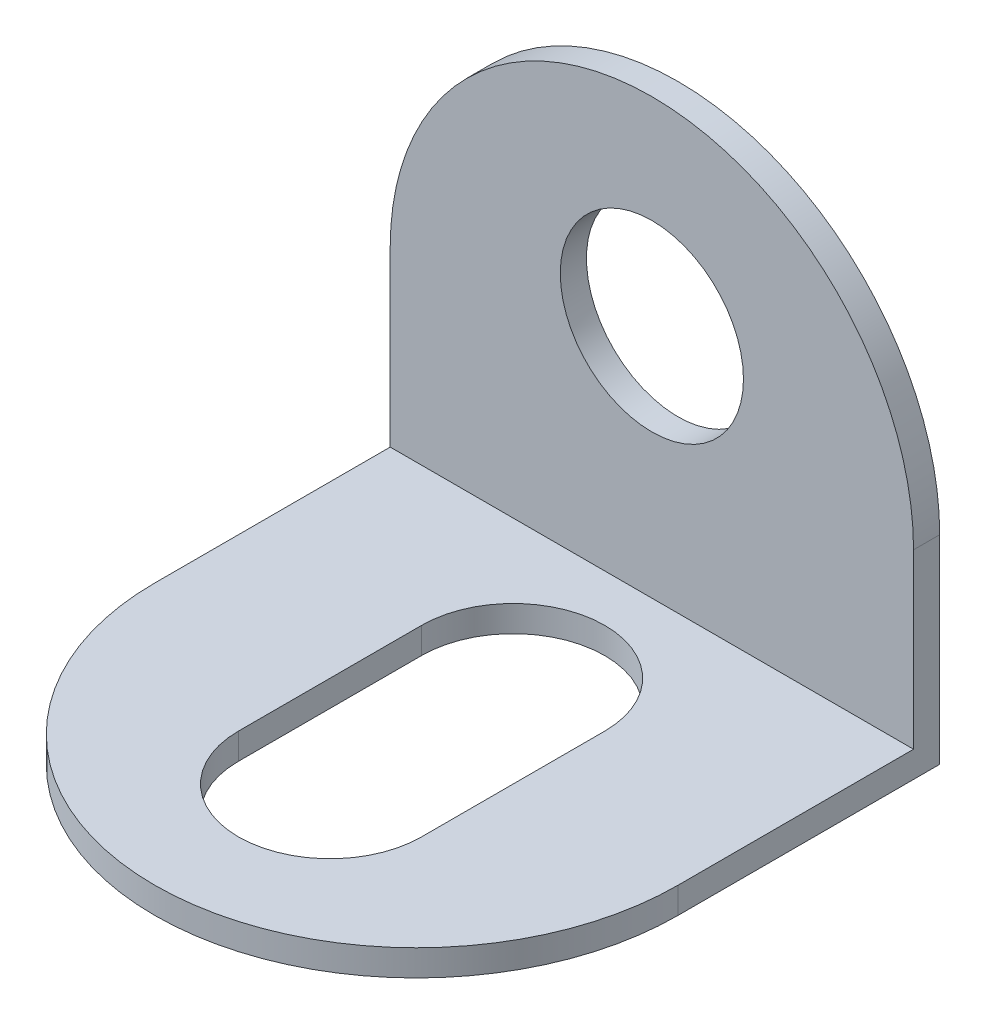
ISO-10303-21;
HEADER;
FILE_DESCRIPTION(('STEP AP214'),'2;1');
FILE_NAME('part.step','',(''),(''),'','','');
FILE_SCHEMA(('AUTOMOTIVE_DESIGN { 1 0 10303 214 1 1 1 1 }'));
ENDSEC;
DATA;
#1=APPLICATION_CONTEXT('core data for automotive mechanical design processes');
#2=APPLICATION_PROTOCOL_DEFINITION('international standard','automotive_design',2000,#1);
#3=PRODUCT_CONTEXT('',#1,'mechanical');
#4=PRODUCT('Part','Part','',(#3));
#5=PRODUCT_RELATED_PRODUCT_CATEGORY('part','',(#4));
#6=PRODUCT_DEFINITION_FORMATION('','',#4);
#7=PRODUCT_DEFINITION_CONTEXT('part definition',#1,'design');
#8=PRODUCT_DEFINITION('design','',#6,#7);
#9=PRODUCT_DEFINITION_SHAPE('','',#8);
#10=(LENGTH_UNIT() NAMED_UNIT(*) SI_UNIT(.MILLI.,.METRE.));
#11=(NAMED_UNIT(*) PLANE_ANGLE_UNIT() SI_UNIT($,.RADIAN.));
#12=(NAMED_UNIT(*) SI_UNIT($,.STERADIAN.) SOLID_ANGLE_UNIT());
#13=UNCERTAINTY_MEASURE_WITH_UNIT(LENGTH_MEASURE(1.E-05),#10,'distance_accuracy_value','');
#14=(GEOMETRIC_REPRESENTATION_CONTEXT(3) GLOBAL_UNCERTAINTY_ASSIGNED_CONTEXT((#13)) GLOBAL_UNIT_ASSIGNED_CONTEXT((#10,
#11,#12)) REPRESENTATION_CONTEXT('',''));
#15=CARTESIAN_POINT('',(0.,0.,0.));
#16=DIRECTION('',(0.,0.,1.));
#17=DIRECTION('',(1.,0.,0.));
#18=AXIS2_PLACEMENT_3D('',#15,#16,#17);
#19=CARTESIAN_POINT('',(-2.22249999999996,-6.34999999999999,8.4455));
#20=DIRECTION('',(-1.,0.,0.));
#21=DIRECTION('',(0.,-1.,0.));
#22=AXIS2_PLACEMENT_3D('',#19,#20,#21);
#23=PLANE('',#22);
#24=DIRECTION('',(0.,0.,-1.));
#25=VECTOR('',#24,1.);
#26=CARTESIAN_POINT('',(-2.22249999999996,-5.715,7.02873096974377));
#27=LINE('',#26,#25);
#28=CARTESIAN_POINT('',(-2.22249999999996,-5.715,8.4455));
#29=VERTEX_POINT('',#28);
#30=CARTESIAN_POINT('',(-2.22250000000002,-5.715,4.00049999999996));
#31=VERTEX_POINT('',#30);
#32=EDGE_CURVE('E35',#29,#31,#27,.T.);
#33=ORIENTED_EDGE('',*,*,#32,.F.);
#34=DIRECTION('',(0.,1.,0.));
#35=VECTOR('',#34,1.);
#36=CARTESIAN_POINT('',(-2.22249999999996,-6.34999999999999,8.4455));
#37=LINE('',#36,#35);
#38=CARTESIAN_POINT('',(-2.22249999999996,-6.34999999999999,8.4455));
#39=VERTEX_POINT('',#38);
#40=EDGE_CURVE('E311',#39,#29,#37,.T.);
#41=ORIENTED_EDGE('',*,*,#40,.F.);
#42=DIRECTION('',(0.,0.,1.));
#43=VECTOR('',#42,1.);
#44=CARTESIAN_POINT('',(-2.22249999999996,-6.34999999999999,7.02873096974377));
#45=LINE('',#44,#43);
#46=CARTESIAN_POINT('',(-2.22250000000002,-6.34999999999999,4.00049999999996));
#47=VERTEX_POINT('',#46);
#48=EDGE_CURVE('E314',#47,#39,#45,.T.);
#49=ORIENTED_EDGE('',*,*,#48,.F.);
#50=DIRECTION('',(0.,1.,0.));
#51=VECTOR('',#50,1.);
#52=CARTESIAN_POINT('',(-2.22250000000002,-6.34999999999999,4.00049999999996));
#53=LINE('',#52,#51);
#54=EDGE_CURVE('E11',#47,#31,#53,.T.);
#55=ORIENTED_EDGE('',*,*,#54,.T.);
#56=EDGE_LOOP('',(#33,#41,#49,#55));
#57=FACE_BOUND('',#56,.T.);
#58=ADVANCED_FACE('F16',(#57),#23,.F.);
#59=CARTESIAN_POINT('',(0.,-6.34999999999999,4.00049999999996));
#60=DIRECTION('',(0.,1.,0.));
#61=DIRECTION('',(1.,0.,0.));
#62=AXIS2_PLACEMENT_3D('',#59,#60,#61);
#63=CYLINDRICAL_SURFACE('',#62,2.2225);
#64=CARTESIAN_POINT('',(0.,-5.715,4.00049999999996));
#65=DIRECTION('',(0.,-1.,0.));
#66=DIRECTION('',(0.,0.,-1.));
#67=AXIS2_PLACEMENT_3D('',#64,#65,#66);
#68=CIRCLE('',#67,2.2225);
#69=CARTESIAN_POINT('',(2.22250000000002,-5.715,4.00049999999996));
#70=VERTEX_POINT('',#69);
#71=EDGE_CURVE('E319',#31,#70,#68,.T.);
#72=ORIENTED_EDGE('',*,*,#71,.F.);
#73=ORIENTED_EDGE('',*,*,#54,.F.);
#74=CARTESIAN_POINT('',(0.,-6.34999999999999,4.00049999999996));
#75=DIRECTION('',(0.,1.,0.));
#76=DIRECTION('',(1.,0.,0.));
#77=AXIS2_PLACEMENT_3D('',#74,#75,#76);
#78=CIRCLE('',#77,2.2225);
#79=CARTESIAN_POINT('',(2.22250000000002,-6.34999999999999,4.00049999999996));
#80=VERTEX_POINT('',#79);
#81=EDGE_CURVE('E138',#80,#47,#78,.T.);
#82=ORIENTED_EDGE('',*,*,#81,.F.);
#83=DIRECTION('',(0.,1.,0.));
#84=VECTOR('',#83,1.);
#85=CARTESIAN_POINT('',(2.22250000000002,-6.34999999999999,4.00049999999996));
#86=LINE('',#85,#84);
#87=EDGE_CURVE('E27',#80,#70,#86,.T.);
#88=ORIENTED_EDGE('',*,*,#87,.T.);
#89=EDGE_LOOP('',(#72,#73,#82,#88));
#90=FACE_BOUND('',#89,.T.);
#91=ADVANCED_FACE('F191',(#90),#63,.F.);
#92=CARTESIAN_POINT('',(2.22250000000002,-6.34999999999999,4.00049999999996));
#93=DIRECTION('',(1.,0.,0.));
#94=DIRECTION('',(0.,1.,0.));
#95=AXIS2_PLACEMENT_3D('',#92,#93,#94);
#96=PLANE('',#95);
#97=DIRECTION('',(0.,0.,1.));
#98=VECTOR('',#97,1.);
#99=CARTESIAN_POINT('',(2.22249999999996,-5.715,4.80623096974375));
#100=LINE('',#99,#98);
#101=CARTESIAN_POINT('',(2.22249999999996,-5.715,8.4455));
#102=VERTEX_POINT('',#101);
#103=EDGE_CURVE('E313',#70,#102,#100,.T.);
#104=ORIENTED_EDGE('',*,*,#103,.F.);
#105=ORIENTED_EDGE('',*,*,#87,.F.);
#106=DIRECTION('',(0.,0.,-1.));
#107=VECTOR('',#106,1.);
#108=CARTESIAN_POINT('',(2.22249999999996,-6.34999999999999,4.80623096974375));
#109=LINE('',#108,#107);
#110=CARTESIAN_POINT('',(2.22249999999996,-6.34999999999999,8.4455));
#111=VERTEX_POINT('',#110);
#112=EDGE_CURVE('E328',#111,#80,#109,.T.);
#113=ORIENTED_EDGE('',*,*,#112,.F.);
#114=DIRECTION('',(0.,1.,0.));
#115=VECTOR('',#114,1.);
#116=CARTESIAN_POINT('',(2.22249999999996,-6.34999999999999,8.4455));
#117=LINE('',#116,#115);
#118=EDGE_CURVE('E309',#111,#102,#117,.T.);
#119=ORIENTED_EDGE('',*,*,#118,.T.);
#120=EDGE_LOOP('',(#104,#105,#113,#119));
#121=FACE_BOUND('',#120,.T.);
#122=ADVANCED_FACE('F196',(#121),#96,.F.);
#123=CARTESIAN_POINT('',(0.,-6.34999999999999,8.4455));
#124=DIRECTION('',(0.,1.,0.));
#125=DIRECTION('',(1.,0.,0.));
#126=AXIS2_PLACEMENT_3D('',#123,#124,#125);
#127=CYLINDRICAL_SURFACE('',#126,2.2225);
#128=CARTESIAN_POINT('',(0.,-5.715,8.4455));
#129=DIRECTION('',(0.,-1.,0.));
#130=DIRECTION('',(0.,0.,-1.));
#131=AXIS2_PLACEMENT_3D('',#128,#129,#130);
#132=CIRCLE('',#131,2.2225);
#133=EDGE_CURVE('E306',#102,#29,#132,.T.);
#134=ORIENTED_EDGE('',*,*,#133,.F.);
#135=ORIENTED_EDGE('',*,*,#118,.F.);
#136=CARTESIAN_POINT('',(0.,-6.34999999999999,8.4455));
#137=DIRECTION('',(0.,1.,0.));
#138=DIRECTION('',(1.,0.,0.));
#139=AXIS2_PLACEMENT_3D('',#136,#137,#138);
#140=CIRCLE('',#139,2.2225);
#141=EDGE_CURVE('E321',#39,#111,#140,.T.);
#142=ORIENTED_EDGE('',*,*,#141,.F.);
#143=ORIENTED_EDGE('',*,*,#40,.T.);
#144=EDGE_LOOP('',(#134,#135,#142,#143));
#145=FACE_BOUND('',#144,.T.);
#146=ADVANCED_FACE('F201',(#145),#127,.F.);
#147=CARTESIAN_POINT('',(0.,-6.34999999999999,6.34999999999997));
#148=DIRECTION('',(0.,1.,0.));
#149=DIRECTION('',(1.,0.,0.));
#150=AXIS2_PLACEMENT_3D('',#147,#148,#149);
#151=CYLINDRICAL_SURFACE('',#150,6.35);
#152=CARTESIAN_POINT('',(0.,-5.715,6.34999999999997));
#153=DIRECTION('',(0.,-1.,0.));
#154=DIRECTION('',(0.,0.,-1.));
#155=AXIS2_PLACEMENT_3D('',#152,#153,#154);
#156=CIRCLE('',#155,6.35);
#157=CARTESIAN_POINT('',(6.34999999999999,-5.715,6.34999999999997));
#158=VERTEX_POINT('',#157);
#159=CARTESIAN_POINT('',(-6.35000000000002,-5.715,6.34999999999997));
#160=VERTEX_POINT('',#159);
#161=EDGE_CURVE('E329',#158,#160,#156,.T.);
#162=ORIENTED_EDGE('',*,*,#161,.T.);
#163=DIRECTION('',(0.,1.,0.));
#164=VECTOR('',#163,1.);
#165=CARTESIAN_POINT('',(-6.35000000000002,-6.34999999999999,6.34999999999997));
#166=LINE('',#165,#164);
#167=CARTESIAN_POINT('',(-6.35000000000002,-6.34999999999999,6.34999999999997));
#168=VERTEX_POINT('',#167);
#169=EDGE_CURVE('E166',#168,#160,#166,.T.);
#170=ORIENTED_EDGE('',*,*,#169,.F.);
#171=CARTESIAN_POINT('',(0.,-6.34999999999999,6.34999999999997));
#172=DIRECTION('',(0.,-1.,0.));
#173=DIRECTION('',(0.,0.,-1.));
#174=AXIS2_PLACEMENT_3D('',#171,#172,#173);
#175=CIRCLE('',#174,6.35);
#176=CARTESIAN_POINT('',(6.34999999999999,-6.34999999999999,6.34999999999997));
#177=VERTEX_POINT('',#176);
#178=EDGE_CURVE('E139',#177,#168,#175,.T.);
#179=ORIENTED_EDGE('',*,*,#178,.F.);
#180=DIRECTION('',(0.,1.,0.));
#181=VECTOR('',#180,1.);
#182=CARTESIAN_POINT('',(6.34999999999999,-6.34999999999999,6.34999999999997));
#183=LINE('',#182,#181);
#184=EDGE_CURVE('E159',#177,#158,#183,.T.);
#185=ORIENTED_EDGE('',*,*,#184,.T.);
#186=EDGE_LOOP('',(#162,#170,#179,#185));
#187=FACE_BOUND('',#186,.T.);
#188=ADVANCED_FACE('F205',(#187),#151,.T.);
#189=CARTESIAN_POINT('',(0.,-5.715,5.61196193948754));
#190=DIRECTION('',(0.,1.,0.));
#191=DIRECTION('',(-1.,0.,0.));
#192=AXIS2_PLACEMENT_3D('',#189,#190,#191);
#193=PLANE('',#192);
#194=ORIENTED_EDGE('',*,*,#32,.T.);
#195=ORIENTED_EDGE('',*,*,#71,.T.);
#196=ORIENTED_EDGE('',*,*,#103,.T.);
#197=ORIENTED_EDGE('',*,*,#133,.T.);
#198=EDGE_LOOP('',(#194,#195,#196,#197));
#199=FACE_BOUND('',#198,.T.);
#200=ORIENTED_EDGE('',*,*,#161,.F.);
#201=DIRECTION('',(0.,0.,1.));
#202=VECTOR('',#201,1.);
#203=CARTESIAN_POINT('',(6.35000000000002,-5.715,0.634999999999941));
#204=LINE('',#203,#202);
#205=CARTESIAN_POINT('',(6.35000000000002,-5.715,0.634999999999941));
#206=VERTEX_POINT('',#205);
#207=EDGE_CURVE('E110',#206,#158,#204,.T.);
#208=ORIENTED_EDGE('',*,*,#207,.F.);
#209=DIRECTION('',(1.,0.,0.));
#210=VECTOR('',#209,1.);
#211=CARTESIAN_POINT('',(0.,-5.715,0.634999999999997));
#212=LINE('',#211,#210);
#213=CARTESIAN_POINT('',(-6.35000000000002,-5.715,0.634999999999941));
#214=VERTEX_POINT('',#213);
#215=EDGE_CURVE('E111',#214,#206,#212,.T.);
#216=ORIENTED_EDGE('',*,*,#215,.F.);
#217=DIRECTION('',(0.,0.,-1.));
#218=VECTOR('',#217,1.);
#219=CARTESIAN_POINT('',(-6.35000000000002,-5.715,6.34999999999997));
#220=LINE('',#219,#218);
#221=EDGE_CURVE('E149',#160,#214,#220,.T.);
#222=ORIENTED_EDGE('',*,*,#221,.F.);
#223=EDGE_LOOP('',(#200,#208,#216,#222));
#224=FACE_BOUND('',#223,.T.);
#225=ADVANCED_FACE('F178',(#199,#224),#193,.T.);
#226=CARTESIAN_POINT('',(0.,0.,0.));
#227=DIRECTION('',(0.,0.,1.));
#228=DIRECTION('',(1.,0.,0.));
#229=AXIS2_PLACEMENT_3D('',#226,#227,#228);
#230=CYLINDRICAL_SURFACE('',#229,2.2225);
#231=CARTESIAN_POINT('',(0.,0.,0.634999999999997));
#232=DIRECTION('',(0.,0.,-1.));
#233=DIRECTION('',(0.,-1.,0.));
#234=AXIS2_PLACEMENT_3D('',#231,#232,#233);
#235=CIRCLE('',#234,2.2225);
#236=CARTESIAN_POINT('',(0.,-2.2225,0.634999999999997));
#237=VERTEX_POINT('',#236);
#238=EDGE_CURVE('E126',#237,#237,#235,.T.);
#239=ORIENTED_EDGE('',*,*,#238,.F.);
#240=EDGE_LOOP('',(#239));
#241=FACE_BOUND('',#240,.T.);
#242=CARTESIAN_POINT('',(0.,0.,0.));
#243=DIRECTION('',(0.,0.,1.));
#244=DIRECTION('',(1.,0.,0.));
#245=AXIS2_PLACEMENT_3D('',#242,#243,#244);
#246=CIRCLE('',#245,2.2225);
#247=CARTESIAN_POINT('',(2.2225,0.,0.));
#248=VERTEX_POINT('',#247);
#249=EDGE_CURVE('E119',#248,#248,#246,.T.);
#250=ORIENTED_EDGE('',*,*,#249,.F.);
#251=EDGE_LOOP('',(#250));
#252=FACE_BOUND('',#251,.T.);
#253=ADVANCED_FACE('F174',(#241,#252),#230,.F.);
#254=CARTESIAN_POINT('',(6.34999999999999,-6.34999999999999,0.));
#255=DIRECTION('',(0.,-1.,0.));
#256=DIRECTION('',(1.,0.,0.));
#257=AXIS2_PLACEMENT_3D('',#254,#255,#256);
#258=PLANE('',#257);
#259=ORIENTED_EDGE('',*,*,#48,.T.);
#260=ORIENTED_EDGE('',*,*,#141,.T.);
#261=ORIENTED_EDGE('',*,*,#112,.T.);
#262=ORIENTED_EDGE('',*,*,#81,.T.);
#263=EDGE_LOOP('',(#259,#260,#261,#262));
#264=FACE_BOUND('',#263,.T.);
#265=DIRECTION('',(0.,0.,1.));
#266=VECTOR('',#265,1.);
#267=CARTESIAN_POINT('',(-6.34999999999997,-6.34999999999999,0.));
#268=LINE('',#267,#266);
#269=CARTESIAN_POINT('',(-6.34999999999997,-6.34999999999999,0.));
#270=VERTEX_POINT('',#269);
#271=EDGE_CURVE('E135',#270,#168,#268,.T.);
#272=ORIENTED_EDGE('',*,*,#271,.F.);
#273=DIRECTION('',(-1.,0.,0.));
#274=VECTOR('',#273,1.);
#275=CARTESIAN_POINT('',(6.34999999999999,-6.34999999999999,0.));
#276=LINE('',#275,#274);
#277=CARTESIAN_POINT('',(6.34999999999999,-6.34999999999999,0.));
#278=VERTEX_POINT('',#277);
#279=EDGE_CURVE('E120',#278,#270,#276,.T.);
#280=ORIENTED_EDGE('',*,*,#279,.F.);
#281=DIRECTION('',(0.,0.,1.));
#282=VECTOR('',#281,1.);
#283=CARTESIAN_POINT('',(6.34999999999999,-6.34999999999999,0.));
#284=LINE('',#283,#282);
#285=EDGE_CURVE('E117',#278,#177,#284,.T.);
#286=ORIENTED_EDGE('',*,*,#285,.T.);
#287=ORIENTED_EDGE('',*,*,#178,.T.);
#288=EDGE_LOOP('',(#272,#280,#286,#287));
#289=FACE_BOUND('',#288,.T.);
#290=ADVANCED_FACE('F177',(#264,#289),#258,.T.);
#291=CARTESIAN_POINT('',(-6.34999999999997,-6.34999999999999,0.));
#292=DIRECTION('',(-1.,0.,0.));
#293=DIRECTION('',(0.,0.,1.));
#294=AXIS2_PLACEMENT_3D('',#291,#292,#293);
#295=PLANE('',#294);
#296=DIRECTION('',(0.,1.,0.));
#297=VECTOR('',#296,1.);
#298=CARTESIAN_POINT('',(-6.35000000000002,-6.34999999999999,0.634999999999941));
#299=LINE('',#298,#297);
#300=CARTESIAN_POINT('',(-6.35000000000002,-1.524,0.634999999999941));
#301=VERTEX_POINT('',#300);
#302=EDGE_CURVE('E140',#214,#301,#299,.T.);
#303=ORIENTED_EDGE('',*,*,#302,.T.);
#304=DIRECTION('',(0.,0.,1.));
#305=VECTOR('',#304,1.);
#306=CARTESIAN_POINT('',(-6.34999999999997,-1.524,0.));
#307=LINE('',#306,#305);
#308=CARTESIAN_POINT('',(-6.34999999999997,-1.524,0.));
#309=VERTEX_POINT('',#308);
#310=EDGE_CURVE('E144',#309,#301,#307,.T.);
#311=ORIENTED_EDGE('',*,*,#310,.F.);
#312=DIRECTION('',(0.,1.,0.));
#313=VECTOR('',#312,1.);
#314=CARTESIAN_POINT('',(-6.34999999999997,-6.34999999999999,0.));
#315=LINE('',#314,#313);
#316=EDGE_CURVE('E101',#270,#309,#315,.T.);
#317=ORIENTED_EDGE('',*,*,#316,.F.);
#318=ORIENTED_EDGE('',*,*,#271,.T.);
#319=ORIENTED_EDGE('',*,*,#169,.T.);
#320=ORIENTED_EDGE('',*,*,#221,.T.);
#321=EDGE_LOOP('',(#303,#311,#317,#318,#319,#320));
#322=FACE_BOUND('',#321,.T.);
#323=ADVANCED_FACE('F209',(#322),#295,.T.);
#324=CARTESIAN_POINT('',(0.,-1.524,0.));
#325=DIRECTION('',(0.,0.,1.));
#326=DIRECTION('',(1.,0.,0.));
#327=AXIS2_PLACEMENT_3D('',#324,#325,#326);
#328=CYLINDRICAL_SURFACE('',#327,6.35);
#329=CARTESIAN_POINT('',(0.,-1.524,0.634999999999997));
#330=DIRECTION('',(0.,0.,-1.));
#331=DIRECTION('',(0.,-1.,0.));
#332=AXIS2_PLACEMENT_3D('',#329,#330,#331);
#333=CIRCLE('',#332,6.35);
#334=CARTESIAN_POINT('',(6.35000000000002,-1.524,0.634999999999941));
#335=VERTEX_POINT('',#334);
#336=EDGE_CURVE('E107',#301,#335,#333,.T.);
#337=ORIENTED_EDGE('',*,*,#336,.T.);
#338=DIRECTION('',(0.,0.,1.));
#339=VECTOR('',#338,1.);
#340=CARTESIAN_POINT('',(6.34999999999999,-1.524,0.));
#341=LINE('',#340,#339);
#342=CARTESIAN_POINT('',(6.34999999999999,-1.524,0.));
#343=VERTEX_POINT('',#342);
#344=EDGE_CURVE('E92',#343,#335,#341,.T.);
#345=ORIENTED_EDGE('',*,*,#344,.F.);
#346=CARTESIAN_POINT('',(0.,-1.524,0.));
#347=DIRECTION('',(0.,0.,-1.));
#348=DIRECTION('',(0.,-1.,0.));
#349=AXIS2_PLACEMENT_3D('',#346,#347,#348);
#350=CIRCLE('',#349,6.35);
#351=EDGE_CURVE('E98',#309,#343,#350,.T.);
#352=ORIENTED_EDGE('',*,*,#351,.F.);
#353=ORIENTED_EDGE('',*,*,#310,.T.);
#354=EDGE_LOOP('',(#337,#345,#352,#353));
#355=FACE_BOUND('',#354,.T.);
#356=ADVANCED_FACE('F18',(#355),#328,.T.);
#357=CARTESIAN_POINT('',(6.34999999999999,-1.524,0.));
#358=DIRECTION('',(1.,0.,0.));
#359=DIRECTION('',(0.,0.,-1.));
#360=AXIS2_PLACEMENT_3D('',#357,#358,#359);
#361=PLANE('',#360);
#362=DIRECTION('',(0.,-1.,0.));
#363=VECTOR('',#362,1.);
#364=CARTESIAN_POINT('',(6.35000000000002,-1.524,0.634999999999941));
#365=LINE('',#364,#363);
#366=EDGE_CURVE('E146',#335,#206,#365,.T.);
#367=ORIENTED_EDGE('',*,*,#366,.T.);
#368=ORIENTED_EDGE('',*,*,#207,.T.);
#369=ORIENTED_EDGE('',*,*,#184,.F.);
#370=ORIENTED_EDGE('',*,*,#285,.F.);
#371=DIRECTION('',(0.,-1.,0.));
#372=VECTOR('',#371,1.);
#373=CARTESIAN_POINT('',(6.34999999999999,-1.524,0.));
#374=LINE('',#373,#372);
#375=EDGE_CURVE('E20',#343,#278,#374,.T.);
#376=ORIENTED_EDGE('',*,*,#375,.F.);
#377=ORIENTED_EDGE('',*,*,#344,.T.);
#378=EDGE_LOOP('',(#367,#368,#369,#370,#376,#377));
#379=FACE_BOUND('',#378,.T.);
#380=ADVANCED_FACE('F114',(#379),#361,.T.);
#381=CARTESIAN_POINT('',(0.,-1.80462652223493,0.634999999999997));
#382=DIRECTION('',(0.,0.,1.));
#383=DIRECTION('',(1.,0.,0.));
#384=AXIS2_PLACEMENT_3D('',#381,#382,#383);
#385=PLANE('',#384);
#386=ORIENTED_EDGE('',*,*,#215,.T.);
#387=ORIENTED_EDGE('',*,*,#366,.F.);
#388=ORIENTED_EDGE('',*,*,#336,.F.);
#389=ORIENTED_EDGE('',*,*,#302,.F.);
#390=EDGE_LOOP('',(#386,#387,#388,#389));
#391=FACE_BOUND('',#390,.T.);
#392=ORIENTED_EDGE('',*,*,#238,.T.);
#393=EDGE_LOOP('',(#392));
#394=FACE_BOUND('',#393,.T.);
#395=ADVANCED_FACE('F172',(#391,#394),#385,.T.);
#396=CARTESIAN_POINT('',(0.,-1.80462652223493,0.));
#397=DIRECTION('',(0.,0.,1.));
#398=DIRECTION('',(1.,0.,0.));
#399=AXIS2_PLACEMENT_3D('',#396,#397,#398);
#400=PLANE('',#399);
#401=ORIENTED_EDGE('',*,*,#249,.T.);
#402=EDGE_LOOP('',(#401));
#403=FACE_BOUND('',#402,.T.);
#404=ORIENTED_EDGE('',*,*,#375,.T.);
#405=ORIENTED_EDGE('',*,*,#279,.T.);
#406=ORIENTED_EDGE('',*,*,#316,.T.);
#407=ORIENTED_EDGE('',*,*,#351,.T.);
#408=EDGE_LOOP('',(#404,#405,#406,#407));
#409=FACE_BOUND('',#408,.T.);
#410=ADVANCED_FACE('F99',(#403,#409),#400,.F.);
#411=CLOSED_SHELL('',(#58,#91,#122,#146,#188,#225,#253,#290,#323,#356,#380,#395,#410));
#412=MANIFOLD_SOLID_BREP('B1',#411);
#413=ADVANCED_BREP_SHAPE_REPRESENTATION('',(#18,#412),#14);
#414=SHAPE_DEFINITION_REPRESENTATION(#9,#413);
ENDSEC;
END-ISO-10303-21;
